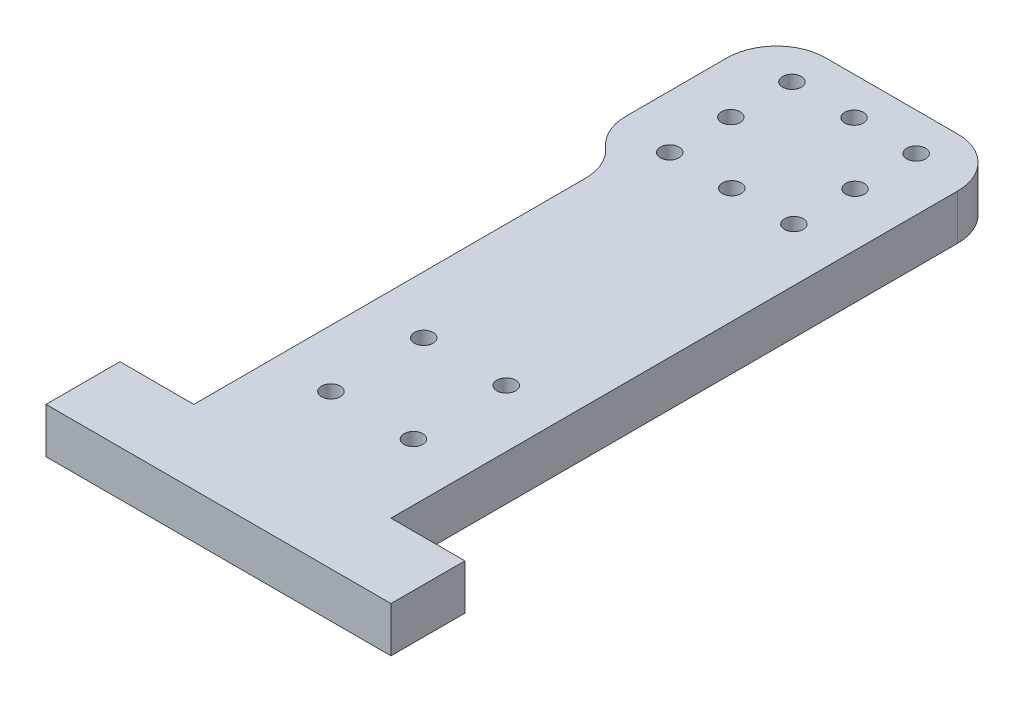
ISO-10303-21;
HEADER;
FILE_DESCRIPTION(('STEP AP214'),'2;1');
FILE_NAME('part.step','',(''),(''),'','','');
FILE_SCHEMA(('AUTOMOTIVE_DESIGN { 1 0 10303 214 1 1 1 1 }'));
ENDSEC;
DATA;
#1=APPLICATION_CONTEXT('core data for automotive mechanical design processes');
#2=APPLICATION_PROTOCOL_DEFINITION('international standard','automotive_design',2000,#1);
#3=PRODUCT_CONTEXT('',#1,'mechanical');
#4=PRODUCT('Part','Part','',(#3));
#5=PRODUCT_RELATED_PRODUCT_CATEGORY('part','',(#4));
#6=PRODUCT_DEFINITION_FORMATION('','',#4);
#7=PRODUCT_DEFINITION_CONTEXT('part definition',#1,'design');
#8=PRODUCT_DEFINITION('design','',#6,#7);
#9=PRODUCT_DEFINITION_SHAPE('','',#8);
#10=(LENGTH_UNIT() NAMED_UNIT(*) SI_UNIT(.MILLI.,.METRE.));
#11=(NAMED_UNIT(*) PLANE_ANGLE_UNIT() SI_UNIT($,.RADIAN.));
#12=(NAMED_UNIT(*) SI_UNIT($,.STERADIAN.) SOLID_ANGLE_UNIT());
#13=UNCERTAINTY_MEASURE_WITH_UNIT(LENGTH_MEASURE(1.E-05),#10,'distance_accuracy_value','');
#14=(GEOMETRIC_REPRESENTATION_CONTEXT(3) GLOBAL_UNCERTAINTY_ASSIGNED_CONTEXT((#13)) GLOBAL_UNIT_ASSIGNED_CONTEXT((#10,
#11,#12)) REPRESENTATION_CONTEXT('',''));
#15=CARTESIAN_POINT('',(0.,0.,0.));
#16=DIRECTION('',(0.,0.,1.));
#17=DIRECTION('',(1.,0.,0.));
#18=AXIS2_PLACEMENT_3D('',#15,#16,#17);
#19=CARTESIAN_POINT('',(0.,0.,0.));
#20=DIRECTION('',(0.,1.,0.));
#21=DIRECTION('',(0.,0.,1.));
#22=AXIS2_PLACEMENT_3D('',#19,#20,#21);
#23=PLANE('',#22);
#24=CARTESIAN_POINT('',(-2.15800000000001,0.,-42.5196));
#25=DIRECTION('',(0.,1.,0.));
#26=DIRECTION('',(0.,0.,1.));
#27=AXIS2_PLACEMENT_3D('',#24,#25,#26);
#28=CIRCLE('',#27,1.2065);
#29=CARTESIAN_POINT('',(-2.15800000000001,0.,-41.3131));
#30=VERTEX_POINT('',#29);
#31=EDGE_CURVE('E215',#30,#30,#28,.T.);
#32=ORIENTED_EDGE('',*,*,#31,.T.);
#33=EDGE_LOOP('',(#32));
#34=FACE_BOUND('',#33,.T.);
#35=CARTESIAN_POINT('',(-2.15800000000001,0.,-58.2676));
#36=DIRECTION('',(0.,1.,0.));
#37=DIRECTION('',(0.,0.,1.));
#38=AXIS2_PLACEMENT_3D('',#35,#36,#37);
#39=CIRCLE('',#38,1.2065);
#40=CARTESIAN_POINT('',(-2.15800000000001,0.,-57.0611));
#41=VERTEX_POINT('',#40);
#42=EDGE_CURVE('E218',#41,#41,#39,.T.);
#43=ORIENTED_EDGE('',*,*,#42,.T.);
#44=EDGE_LOOP('',(#43));
#45=FACE_BOUND('',#44,.T.);
#46=CARTESIAN_POINT('',(-10.158,0.,-58.2676));
#47=DIRECTION('',(0.,1.,0.));
#48=DIRECTION('',(0.,0.,1.));
#49=AXIS2_PLACEMENT_3D('',#46,#47,#48);
#50=CIRCLE('',#49,1.2065);
#51=CARTESIAN_POINT('',(-10.158,0.,-57.0611));
#52=VERTEX_POINT('',#51);
#53=EDGE_CURVE('E221',#52,#52,#50,.T.);
#54=ORIENTED_EDGE('',*,*,#53,.T.);
#55=EDGE_LOOP('',(#54));
#56=FACE_BOUND('',#55,.T.);
#57=CARTESIAN_POINT('',(-10.158,0.,-50.3936));
#58=DIRECTION('',(0.,1.,0.));
#59=DIRECTION('',(0.,0.,1.));
#60=AXIS2_PLACEMENT_3D('',#57,#58,#59);
#61=CIRCLE('',#60,1.2065);
#62=CARTESIAN_POINT('',(-10.158,0.,-49.1871));
#63=VERTEX_POINT('',#62);
#64=EDGE_CURVE('E224',#63,#63,#61,.T.);
#65=ORIENTED_EDGE('',*,*,#64,.T.);
#66=EDGE_LOOP('',(#65));
#67=FACE_BOUND('',#66,.T.);
#68=CARTESIAN_POINT('',(-10.158,0.,-42.5196));
#69=DIRECTION('',(0.,1.,0.));
#70=DIRECTION('',(0.,0.,1.));
#71=AXIS2_PLACEMENT_3D('',#68,#69,#70);
#72=CIRCLE('',#71,1.2065);
#73=CARTESIAN_POINT('',(-10.158,0.,-41.3131));
#74=VERTEX_POINT('',#73);
#75=EDGE_CURVE('E227',#74,#74,#72,.T.);
#76=ORIENTED_EDGE('',*,*,#75,.T.);
#77=EDGE_LOOP('',(#76));
#78=FACE_BOUND('',#77,.T.);
#79=CARTESIAN_POINT('',(5.842,0.,-58.2676));
#80=DIRECTION('',(0.,1.,0.));
#81=DIRECTION('',(0.,0.,1.));
#82=AXIS2_PLACEMENT_3D('',#79,#80,#81);
#83=CIRCLE('',#82,1.2065);
#84=CARTESIAN_POINT('',(5.842,0.,-57.0611));
#85=VERTEX_POINT('',#84);
#86=EDGE_CURVE('E230',#85,#85,#83,.T.);
#87=ORIENTED_EDGE('',*,*,#86,.T.);
#88=EDGE_LOOP('',(#87));
#89=FACE_BOUND('',#88,.T.);
#90=CARTESIAN_POINT('',(5.842,0.,-50.3936));
#91=DIRECTION('',(0.,1.,0.));
#92=DIRECTION('',(0.,0.,1.));
#93=AXIS2_PLACEMENT_3D('',#90,#91,#92);
#94=CIRCLE('',#93,1.2065);
#95=CARTESIAN_POINT('',(5.842,0.,-49.1871));
#96=VERTEX_POINT('',#95);
#97=EDGE_CURVE('E233',#96,#96,#94,.T.);
#98=ORIENTED_EDGE('',*,*,#97,.T.);
#99=EDGE_LOOP('',(#98));
#100=FACE_BOUND('',#99,.T.);
#101=CARTESIAN_POINT('',(5.842,0.,-42.5196));
#102=DIRECTION('',(0.,1.,0.));
#103=DIRECTION('',(0.,0.,1.));
#104=AXIS2_PLACEMENT_3D('',#101,#102,#103);
#105=CIRCLE('',#104,1.2065);
#106=CARTESIAN_POINT('',(5.842,0.,-41.3131));
#107=VERTEX_POINT('',#106);
#108=EDGE_CURVE('E236',#107,#107,#105,.T.);
#109=ORIENTED_EDGE('',*,*,#108,.T.);
#110=EDGE_LOOP('',(#109));
#111=FACE_BOUND('',#110,.T.);
#112=CARTESIAN_POINT('',(5.31451033065303,0.,5.97926918764177));
#113=DIRECTION('',(0.,1.,0.));
#114=DIRECTION('',(0.,0.,1.));
#115=AXIS2_PLACEMENT_3D('',#112,#113,#114);
#116=CIRCLE('',#115,1.2065);
#117=CARTESIAN_POINT('',(5.31451033065303,0.,7.18576918764177));
#118=VERTEX_POINT('',#117);
#119=EDGE_CURVE('E239',#118,#118,#116,.T.);
#120=ORIENTED_EDGE('',*,*,#119,.T.);
#121=EDGE_LOOP('',(#120));
#122=FACE_BOUND('',#121,.T.);
#123=CARTESIAN_POINT('',(-5.31451033065303,0.,5.97926918764177));
#124=DIRECTION('',(0.,1.,0.));
#125=DIRECTION('',(0.,0.,1.));
#126=AXIS2_PLACEMENT_3D('',#123,#124,#125);
#127=CIRCLE('',#126,1.2065);
#128=CARTESIAN_POINT('',(-5.31451033065303,0.,7.18576918764177));
#129=VERTEX_POINT('',#128);
#130=EDGE_CURVE('E242',#129,#129,#127,.T.);
#131=ORIENTED_EDGE('',*,*,#130,.T.);
#132=EDGE_LOOP('',(#131));
#133=FACE_BOUND('',#132,.T.);
#134=CARTESIAN_POINT('',(-5.31451033065303,0.,-5.97926918764177));
#135=DIRECTION('',(0.,1.,0.));
#136=DIRECTION('',(0.,0.,1.));
#137=AXIS2_PLACEMENT_3D('',#134,#135,#136);
#138=CIRCLE('',#137,1.2065);
#139=CARTESIAN_POINT('',(-5.31451033065303,0.,-4.77276918764177));
#140=VERTEX_POINT('',#139);
#141=EDGE_CURVE('E245',#140,#140,#138,.T.);
#142=ORIENTED_EDGE('',*,*,#141,.T.);
#143=EDGE_LOOP('',(#142));
#144=FACE_BOUND('',#143,.T.);
#145=CARTESIAN_POINT('',(5.31451033065303,0.,-5.97926918764177));
#146=DIRECTION('',(0.,1.,0.));
#147=DIRECTION('',(0.,0.,1.));
#148=AXIS2_PLACEMENT_3D('',#145,#146,#147);
#149=CIRCLE('',#148,1.2065);
#150=CARTESIAN_POINT('',(5.31451033065303,0.,-4.77276918764177));
#151=VERTEX_POINT('',#150);
#152=EDGE_CURVE('E248',#151,#151,#149,.T.);
#153=ORIENTED_EDGE('',*,*,#152,.T.);
#154=EDGE_LOOP('',(#153));
#155=FACE_BOUND('',#154,.T.);
#156=CARTESIAN_POINT('',(-10.666,0.,-43.7344255044843));
#157=DIRECTION('',(0.,-1.,0.));
#158=DIRECTION('',(0.,0.,-1.));
#159=AXIS2_PLACEMENT_3D('',#156,#157,#158);
#160=CIRCLE('',#159,6.35);
#161=CARTESIAN_POINT('',(-17.016,0.,-43.7344255044843));
#162=VERTEX_POINT('',#161);
#163=CARTESIAN_POINT('',(-14.858,0.,-38.9647676551202));
#164=VERTEX_POINT('',#163);
#165=EDGE_CURVE('E254',#162,#164,#160,.F.);
#166=ORIENTED_EDGE('',*,*,#165,.F.);
#167=DIRECTION('',(0.,0.,1.));
#168=VECTOR('',#167,1.);
#169=CARTESIAN_POINT('',(-17.016,0.,-63.119));
#170=LINE('',#169,#168);
#171=CARTESIAN_POINT('',(-17.016,0.,-56.769));
#172=VERTEX_POINT('',#171);
#173=EDGE_CURVE('E163',#172,#162,#170,.T.);
#174=ORIENTED_EDGE('',*,*,#173,.F.);
#175=CARTESIAN_POINT('',(-10.666,0.,-56.769));
#176=DIRECTION('',(0.,-1.,0.));
#177=DIRECTION('',(0.,0.,-1.));
#178=AXIS2_PLACEMENT_3D('',#175,#176,#177);
#179=CIRCLE('',#178,6.35);
#180=CARTESIAN_POINT('',(-10.666,0.,-63.119));
#181=VERTEX_POINT('',#180);
#182=EDGE_CURVE('E256',#181,#172,#179,.F.);
#183=ORIENTED_EDGE('',*,*,#182,.F.);
#184=DIRECTION('',(-1.,0.,0.));
#185=VECTOR('',#184,1.);
#186=CARTESIAN_POINT('',(12.7,0.,-63.119));
#187=LINE('',#186,#185);
#188=CARTESIAN_POINT('',(6.35,0.,-63.119));
#189=VERTEX_POINT('',#188);
#190=EDGE_CURVE('E115',#189,#181,#187,.T.);
#191=ORIENTED_EDGE('',*,*,#190,.F.);
#192=CARTESIAN_POINT('',(6.35,0.,-56.769));
#193=DIRECTION('',(0.,-1.,0.));
#194=DIRECTION('',(0.,0.,-1.));
#195=AXIS2_PLACEMENT_3D('',#192,#193,#194);
#196=CIRCLE('',#195,6.35);
#197=CARTESIAN_POINT('',(12.7,0.,-56.769));
#198=VERTEX_POINT('',#197);
#199=EDGE_CURVE('E19',#198,#189,#196,.F.);
#200=ORIENTED_EDGE('',*,*,#199,.F.);
#201=DIRECTION('',(0.,0.,-1.));
#202=VECTOR('',#201,1.);
#203=CARTESIAN_POINT('',(12.7,0.,16.256));
#204=LINE('',#203,#202);
#205=CARTESIAN_POINT('',(12.7,0.,16.256));
#206=VERTEX_POINT('',#205);
#207=EDGE_CURVE('E113',#206,#198,#204,.T.);
#208=ORIENTED_EDGE('',*,*,#207,.F.);
#209=DIRECTION('',(-1.,0.,0.));
#210=VECTOR('',#209,1.);
#211=CARTESIAN_POINT('',(22.225,0.,16.256));
#212=LINE('',#211,#210);
#213=CARTESIAN_POINT('',(22.225,0.,16.256));
#214=VERTEX_POINT('',#213);
#215=EDGE_CURVE('E128',#214,#206,#212,.T.);
#216=ORIENTED_EDGE('',*,*,#215,.F.);
#217=DIRECTION('',(0.,0.,-1.));
#218=VECTOR('',#217,1.);
#219=CARTESIAN_POINT('',(22.225,0.,25.781));
#220=LINE('',#219,#218);
#221=CARTESIAN_POINT('',(22.225,0.,25.781));
#222=VERTEX_POINT('',#221);
#223=EDGE_CURVE('E137',#222,#214,#220,.T.);
#224=ORIENTED_EDGE('',*,*,#223,.F.);
#225=DIRECTION('',(1.,0.,0.));
#226=VECTOR('',#225,1.);
#227=CARTESIAN_POINT('',(-22.225,0.,25.781));
#228=LINE('',#227,#226);
#229=CARTESIAN_POINT('',(-22.225,0.,25.781));
#230=VERTEX_POINT('',#229);
#231=EDGE_CURVE('E142',#230,#222,#228,.T.);
#232=ORIENTED_EDGE('',*,*,#231,.F.);
#233=DIRECTION('',(0.,0.,1.));
#234=VECTOR('',#233,1.);
#235=CARTESIAN_POINT('',(-22.225,0.,16.256));
#236=LINE('',#235,#234);
#237=CARTESIAN_POINT('',(-22.225,0.,16.256));
#238=VERTEX_POINT('',#237);
#239=EDGE_CURVE('E147',#238,#230,#236,.T.);
#240=ORIENTED_EDGE('',*,*,#239,.F.);
#241=DIRECTION('',(-1.,0.,0.));
#242=VECTOR('',#241,1.);
#243=CARTESIAN_POINT('',(22.225,0.,16.256));
#244=LINE('',#243,#242);
#245=CARTESIAN_POINT('',(-12.7,0.,16.256));
#246=VERTEX_POINT('',#245);
#247=EDGE_CURVE('E152',#246,#238,#244,.T.);
#248=ORIENTED_EDGE('',*,*,#247,.F.);
#249=DIRECTION('',(0.,0.,1.));
#250=VECTOR('',#249,1.);
#251=CARTESIAN_POINT('',(-12.7,0.,-16.256));
#252=LINE('',#251,#250);
#253=CARTESIAN_POINT('',(-12.7,0.,-34.1951098057562));
#254=VERTEX_POINT('',#253);
#255=EDGE_CURVE('E155',#254,#246,#252,.T.);
#256=ORIENTED_EDGE('',*,*,#255,.F.);
#257=CARTESIAN_POINT('',(-19.05,0.,-34.1951098057562));
#258=DIRECTION('',(0.,1.,0.));
#259=DIRECTION('',(0.,0.,1.));
#260=AXIS2_PLACEMENT_3D('',#257,#258,#259);
#261=CIRCLE('',#260,6.35);
#262=EDGE_CURVE('E251',#254,#164,#261,.T.);
#263=ORIENTED_EDGE('',*,*,#262,.T.);
#264=EDGE_LOOP('',(#166,#174,#183,#191,#200,#208,#216,#224,#232,#240,#248,#256,#263));
#265=FACE_BOUND('',#264,.T.);
#266=ADVANCED_FACE('F16',(#34,#45,#56,#67,#78,#89,#100,#111,#122,#133,#144,#155,#265),#23,.F.);
#267=CARTESIAN_POINT('',(6.35,14.0684504,-56.769));
#268=DIRECTION('',(0.,-1.,0.));
#269=DIRECTION('',(0.,0.,-1.));
#270=AXIS2_PLACEMENT_3D('',#267,#268,#269);
#271=CYLINDRICAL_SURFACE('',#270,6.35);
#272=DIRECTION('',(0.,1.,0.));
#273=VECTOR('',#272,1.);
#274=CARTESIAN_POINT('',(12.7,0.,-56.769));
#275=LINE('',#274,#273);
#276=CARTESIAN_POINT('',(12.7,5.842,-56.769));
#277=VERTEX_POINT('',#276);
#278=EDGE_CURVE('E120',#198,#277,#275,.T.);
#279=ORIENTED_EDGE('',*,*,#278,.F.);
#280=ORIENTED_EDGE('',*,*,#199,.T.);
#281=DIRECTION('',(0.,1.,0.));
#282=VECTOR('',#281,1.);
#283=CARTESIAN_POINT('',(6.35,5.842,-63.119));
#284=LINE('',#283,#282);
#285=CARTESIAN_POINT('',(6.35,5.842,-63.119));
#286=VERTEX_POINT('',#285);
#287=EDGE_CURVE('E118',#286,#189,#284,.F.);
#288=ORIENTED_EDGE('',*,*,#287,.F.);
#289=CARTESIAN_POINT('',(6.35,5.842,-56.769));
#290=DIRECTION('',(0.,-1.,0.));
#291=DIRECTION('',(0.,0.,-1.));
#292=AXIS2_PLACEMENT_3D('',#289,#290,#291);
#293=CIRCLE('',#292,6.35);
#294=EDGE_CURVE('E123',#277,#286,#293,.F.);
#295=ORIENTED_EDGE('',*,*,#294,.F.);
#296=EDGE_LOOP('',(#279,#280,#288,#295));
#297=FACE_BOUND('',#296,.T.);
#298=ADVANCED_FACE('F121',(#297),#271,.T.);
#299=CARTESIAN_POINT('',(12.7,5.842,-63.119));
#300=DIRECTION('',(0.,0.,-1.));
#301=DIRECTION('',(-1.,0.,0.));
#302=AXIS2_PLACEMENT_3D('',#299,#300,#301);
#303=PLANE('',#302);
#304=ORIENTED_EDGE('',*,*,#190,.T.);
#305=DIRECTION('',(0.,-1.,0.));
#306=VECTOR('',#305,1.);
#307=CARTESIAN_POINT('',(-10.666,14.0684504,-63.119));
#308=LINE('',#307,#306);
#309=CARTESIAN_POINT('',(-10.666,5.842,-63.119));
#310=VERTEX_POINT('',#309);
#311=EDGE_CURVE('E167',#310,#181,#308,.T.);
#312=ORIENTED_EDGE('',*,*,#311,.F.);
#313=DIRECTION('',(1.,0.,0.));
#314=VECTOR('',#313,1.);
#315=CARTESIAN_POINT('',(0.,5.842,-63.119));
#316=LINE('',#315,#314);
#317=EDGE_CURVE('E213',#286,#310,#316,.F.);
#318=ORIENTED_EDGE('',*,*,#317,.F.);
#319=ORIENTED_EDGE('',*,*,#287,.T.);
#320=EDGE_LOOP('',(#304,#312,#318,#319));
#321=FACE_BOUND('',#320,.T.);
#322=ADVANCED_FACE('F268',(#321),#303,.T.);
#323=CARTESIAN_POINT('',(-10.666,14.0684504,-56.769));
#324=DIRECTION('',(0.,-1.,0.));
#325=DIRECTION('',(0.,0.,-1.));
#326=AXIS2_PLACEMENT_3D('',#323,#324,#325);
#327=CYLINDRICAL_SURFACE('',#326,6.35);
#328=ORIENTED_EDGE('',*,*,#311,.T.);
#329=ORIENTED_EDGE('',*,*,#182,.T.);
#330=DIRECTION('',(0.,1.,0.));
#331=VECTOR('',#330,1.);
#332=CARTESIAN_POINT('',(-17.016,5.842,-56.769));
#333=LINE('',#332,#331);
#334=CARTESIAN_POINT('',(-17.016,5.842,-56.769));
#335=VERTEX_POINT('',#334);
#336=EDGE_CURVE('E166',#335,#172,#333,.F.);
#337=ORIENTED_EDGE('',*,*,#336,.F.);
#338=CARTESIAN_POINT('',(-10.666,5.842,-56.769));
#339=DIRECTION('',(0.,-1.,0.));
#340=DIRECTION('',(0.,0.,-1.));
#341=AXIS2_PLACEMENT_3D('',#338,#339,#340);
#342=CIRCLE('',#341,6.35);
#343=EDGE_CURVE('E210',#310,#335,#342,.F.);
#344=ORIENTED_EDGE('',*,*,#343,.F.);
#345=EDGE_LOOP('',(#328,#329,#337,#344));
#346=FACE_BOUND('',#345,.T.);
#347=ADVANCED_FACE('F346',(#346),#327,.T.);
#348=CARTESIAN_POINT('',(-17.016,5.842,-63.119));
#349=DIRECTION('',(-1.,0.,0.));
#350=DIRECTION('',(0.,0.,1.));
#351=AXIS2_PLACEMENT_3D('',#348,#349,#350);
#352=PLANE('',#351);
#353=ORIENTED_EDGE('',*,*,#173,.T.);
#354=DIRECTION('',(0.,-1.,0.));
#355=VECTOR('',#354,1.);
#356=CARTESIAN_POINT('',(-17.016,14.1910320385967,-43.7344255044843));
#357=LINE('',#356,#355);
#358=CARTESIAN_POINT('',(-17.016,5.842,-43.7344255044843));
#359=VERTEX_POINT('',#358);
#360=EDGE_CURVE('E165',#359,#162,#357,.T.);
#361=ORIENTED_EDGE('',*,*,#360,.F.);
#362=DIRECTION('',(0.,0.,1.));
#363=VECTOR('',#362,1.);
#364=CARTESIAN_POINT('',(-17.016,5.842,0.));
#365=LINE('',#364,#363);
#366=EDGE_CURVE('E209',#335,#359,#365,.T.);
#367=ORIENTED_EDGE('',*,*,#366,.F.);
#368=ORIENTED_EDGE('',*,*,#336,.T.);
#369=EDGE_LOOP('',(#353,#361,#367,#368));
#370=FACE_BOUND('',#369,.T.);
#371=ADVANCED_FACE('F340',(#370),#352,.T.);
#372=CARTESIAN_POINT('',(-10.666,14.1910320385967,-43.7344255044843));
#373=DIRECTION('',(0.,-1.,0.));
#374=DIRECTION('',(0.,0.,-1.));
#375=AXIS2_PLACEMENT_3D('',#372,#373,#374);
#376=CYLINDRICAL_SURFACE('',#375,6.35);
#377=ORIENTED_EDGE('',*,*,#165,.T.);
#378=DIRECTION('',(0.,1.,0.));
#379=VECTOR('',#378,1.);
#380=CARTESIAN_POINT('',(-14.858,-8.2264504,-38.9647676551202));
#381=LINE('',#380,#379);
#382=CARTESIAN_POINT('',(-14.858,5.842,-38.9647676551202));
#383=VERTEX_POINT('',#382);
#384=EDGE_CURVE('E253',#164,#383,#381,.T.);
#385=ORIENTED_EDGE('',*,*,#384,.T.);
#386=CARTESIAN_POINT('',(-10.666,5.842,-43.7344255044843));
#387=DIRECTION('',(0.,-1.,0.));
#388=DIRECTION('',(0.,0.,-1.));
#389=AXIS2_PLACEMENT_3D('',#386,#387,#388);
#390=CIRCLE('',#389,6.35);
#391=EDGE_CURVE('E206',#359,#383,#390,.F.);
#392=ORIENTED_EDGE('',*,*,#391,.F.);
#393=ORIENTED_EDGE('',*,*,#360,.T.);
#394=EDGE_LOOP('',(#377,#385,#392,#393));
#395=FACE_BOUND('',#394,.T.);
#396=ADVANCED_FACE('F336',(#395),#376,.T.);
#397=CARTESIAN_POINT('',(-19.05,-8.2264504,-34.1951098057562));
#398=DIRECTION('',(0.,1.,0.));
#399=DIRECTION('',(0.,0.,1.));
#400=AXIS2_PLACEMENT_3D('',#397,#398,#399);
#401=CYLINDRICAL_SURFACE('',#400,6.35);
#402=ORIENTED_EDGE('',*,*,#384,.F.);
#403=ORIENTED_EDGE('',*,*,#262,.F.);
#404=DIRECTION('',(0.,1.,0.));
#405=VECTOR('',#404,1.);
#406=CARTESIAN_POINT('',(-12.7,0.,-34.1951098057562));
#407=LINE('',#406,#405);
#408=CARTESIAN_POINT('',(-12.7,5.842,-34.1951098057562));
#409=VERTEX_POINT('',#408);
#410=EDGE_CURVE('E160',#409,#254,#407,.F.);
#411=ORIENTED_EDGE('',*,*,#410,.F.);
#412=CARTESIAN_POINT('',(-19.05,5.842,-34.1951098057562));
#413=DIRECTION('',(0.,1.,0.));
#414=DIRECTION('',(0.,0.,1.));
#415=AXIS2_PLACEMENT_3D('',#412,#413,#414);
#416=CIRCLE('',#415,6.35);
#417=EDGE_CURVE('E202',#383,#409,#416,.F.);
#418=ORIENTED_EDGE('',*,*,#417,.F.);
#419=EDGE_LOOP('',(#402,#403,#411,#418));
#420=FACE_BOUND('',#419,.T.);
#421=ADVANCED_FACE('F343',(#420),#401,.F.);
#422=CARTESIAN_POINT('',(-12.7,0.,-16.256));
#423=DIRECTION('',(-1.,0.,0.));
#424=DIRECTION('',(0.,0.,1.));
#425=AXIS2_PLACEMENT_3D('',#422,#423,#424);
#426=PLANE('',#425);
#427=ORIENTED_EDGE('',*,*,#255,.T.);
#428=DIRECTION('',(0.,1.,0.));
#429=VECTOR('',#428,1.);
#430=CARTESIAN_POINT('',(-12.7,5.842,16.256));
#431=LINE('',#430,#429);
#432=CARTESIAN_POINT('',(-12.7,5.842,16.256));
#433=VERTEX_POINT('',#432);
#434=EDGE_CURVE('E154',#433,#246,#431,.F.);
#435=ORIENTED_EDGE('',*,*,#434,.F.);
#436=DIRECTION('',(0.,0.,1.));
#437=VECTOR('',#436,1.);
#438=CARTESIAN_POINT('',(-12.7,5.842,0.));
#439=LINE('',#438,#437);
#440=EDGE_CURVE('E205',#409,#433,#439,.T.);
#441=ORIENTED_EDGE('',*,*,#440,.F.);
#442=ORIENTED_EDGE('',*,*,#410,.T.);
#443=EDGE_LOOP('',(#427,#435,#441,#442));
#444=FACE_BOUND('',#443,.T.);
#445=ADVANCED_FACE('F431',(#444),#426,.T.);
#446=CARTESIAN_POINT('',(22.225,5.842,16.256));
#447=DIRECTION('',(0.,0.,-1.));
#448=DIRECTION('',(-1.,0.,0.));
#449=AXIS2_PLACEMENT_3D('',#446,#447,#448);
#450=PLANE('',#449);
#451=DIRECTION('',(1.,0.,0.));
#452=VECTOR('',#451,1.);
#453=CARTESIAN_POINT('',(0.,5.842,16.256));
#454=LINE('',#453,#452);
#455=CARTESIAN_POINT('',(-22.225,5.842,16.256));
#456=VERTEX_POINT('',#455);
#457=EDGE_CURVE('E284',#433,#456,#454,.F.);
#458=ORIENTED_EDGE('',*,*,#457,.F.);
#459=ORIENTED_EDGE('',*,*,#434,.T.);
#460=ORIENTED_EDGE('',*,*,#247,.T.);
#461=DIRECTION('',(0.,1.,0.));
#462=VECTOR('',#461,1.);
#463=CARTESIAN_POINT('',(-22.225,5.842,16.256));
#464=LINE('',#463,#462);
#465=EDGE_CURVE('E149',#456,#238,#464,.F.);
#466=ORIENTED_EDGE('',*,*,#465,.F.);
#467=EDGE_LOOP('',(#458,#459,#460,#466));
#468=FACE_BOUND('',#467,.T.);
#469=ADVANCED_FACE('F427',(#468),#450,.T.);
#470=CARTESIAN_POINT('',(-22.225,5.842,16.256));
#471=DIRECTION('',(-1.,0.,0.));
#472=DIRECTION('',(0.,0.,1.));
#473=AXIS2_PLACEMENT_3D('',#470,#471,#472);
#474=PLANE('',#473);
#475=DIRECTION('',(0.,1.,0.));
#476=VECTOR('',#475,1.);
#477=CARTESIAN_POINT('',(-22.225,5.842,25.781));
#478=LINE('',#477,#476);
#479=CARTESIAN_POINT('',(-22.225,5.842,25.781));
#480=VERTEX_POINT('',#479);
#481=EDGE_CURVE('E144',#480,#230,#478,.F.);
#482=ORIENTED_EDGE('',*,*,#481,.F.);
#483=DIRECTION('',(0.,0.,1.));
#484=VECTOR('',#483,1.);
#485=CARTESIAN_POINT('',(-22.225,5.842,0.));
#486=LINE('',#485,#484);
#487=EDGE_CURVE('E308',#456,#480,#486,.T.);
#488=ORIENTED_EDGE('',*,*,#487,.F.);
#489=ORIENTED_EDGE('',*,*,#465,.T.);
#490=ORIENTED_EDGE('',*,*,#239,.T.);
#491=EDGE_LOOP('',(#482,#488,#489,#490));
#492=FACE_BOUND('',#491,.T.);
#493=ADVANCED_FACE('F423',(#492),#474,.T.);
#494=CARTESIAN_POINT('',(-22.225,5.842,25.781));
#495=DIRECTION('',(0.,0.,1.));
#496=DIRECTION('',(1.,0.,0.));
#497=AXIS2_PLACEMENT_3D('',#494,#495,#496);
#498=PLANE('',#497);
#499=DIRECTION('',(0.,1.,0.));
#500=VECTOR('',#499,1.);
#501=CARTESIAN_POINT('',(22.225,5.842,25.781));
#502=LINE('',#501,#500);
#503=CARTESIAN_POINT('',(22.225,5.842,25.781));
#504=VERTEX_POINT('',#503);
#505=EDGE_CURVE('E139',#504,#222,#502,.F.);
#506=ORIENTED_EDGE('',*,*,#505,.F.);
#507=DIRECTION('',(1.,0.,0.));
#508=VECTOR('',#507,1.);
#509=CARTESIAN_POINT('',(0.,5.842,25.781));
#510=LINE('',#509,#508);
#511=EDGE_CURVE('E299',#480,#504,#510,.T.);
#512=ORIENTED_EDGE('',*,*,#511,.F.);
#513=ORIENTED_EDGE('',*,*,#481,.T.);
#514=ORIENTED_EDGE('',*,*,#231,.T.);
#515=EDGE_LOOP('',(#506,#512,#513,#514));
#516=FACE_BOUND('',#515,.T.);
#517=ADVANCED_FACE('F419',(#516),#498,.T.);
#518=CARTESIAN_POINT('',(22.225,5.842,25.781));
#519=DIRECTION('',(1.,0.,0.));
#520=DIRECTION('',(0.,0.,-1.));
#521=AXIS2_PLACEMENT_3D('',#518,#519,#520);
#522=PLANE('',#521);
#523=DIRECTION('',(0.,1.,0.));
#524=VECTOR('',#523,1.);
#525=CARTESIAN_POINT('',(22.225,5.842,16.256));
#526=LINE('',#525,#524);
#527=CARTESIAN_POINT('',(22.225,5.842,16.256));
#528=VERTEX_POINT('',#527);
#529=EDGE_CURVE('E130',#528,#214,#526,.F.);
#530=ORIENTED_EDGE('',*,*,#529,.F.);
#531=DIRECTION('',(0.,0.,1.));
#532=VECTOR('',#531,1.);
#533=CARTESIAN_POINT('',(22.225,5.842,0.));
#534=LINE('',#533,#532);
#535=EDGE_CURVE('E277',#504,#528,#534,.F.);
#536=ORIENTED_EDGE('',*,*,#535,.F.);
#537=ORIENTED_EDGE('',*,*,#505,.T.);
#538=ORIENTED_EDGE('',*,*,#223,.T.);
#539=EDGE_LOOP('',(#530,#536,#537,#538));
#540=FACE_BOUND('',#539,.T.);
#541=ADVANCED_FACE('F416',(#540),#522,.T.);
#542=CARTESIAN_POINT('',(22.225,5.842,16.256));
#543=DIRECTION('',(0.,0.,-1.));
#544=DIRECTION('',(-1.,0.,0.));
#545=AXIS2_PLACEMENT_3D('',#542,#543,#544);
#546=PLANE('',#545);
#547=ORIENTED_EDGE('',*,*,#215,.T.);
#548=DIRECTION('',(0.,1.,0.));
#549=VECTOR('',#548,1.);
#550=CARTESIAN_POINT('',(12.7,0.,16.256));
#551=LINE('',#550,#549);
#552=CARTESIAN_POINT('',(12.7,5.842,16.256));
#553=VERTEX_POINT('',#552);
#554=EDGE_CURVE('E34',#553,#206,#551,.F.);
#555=ORIENTED_EDGE('',*,*,#554,.F.);
#556=DIRECTION('',(1.,0.,0.));
#557=VECTOR('',#556,1.);
#558=CARTESIAN_POINT('',(0.,5.842,16.256));
#559=LINE('',#558,#557);
#560=EDGE_CURVE('E275',#528,#553,#559,.F.);
#561=ORIENTED_EDGE('',*,*,#560,.F.);
#562=ORIENTED_EDGE('',*,*,#529,.T.);
#563=EDGE_LOOP('',(#547,#555,#561,#562));
#564=FACE_BOUND('',#563,.T.);
#565=ADVANCED_FACE('F413',(#564),#546,.T.);
#566=CARTESIAN_POINT('',(12.7,0.,16.256));
#567=DIRECTION('',(1.,0.,0.));
#568=DIRECTION('',(0.,0.,-1.));
#569=AXIS2_PLACEMENT_3D('',#566,#567,#568);
#570=PLANE('',#569);
#571=DIRECTION('',(0.,0.,1.));
#572=VECTOR('',#571,1.);
#573=CARTESIAN_POINT('',(12.7,5.842,0.));
#574=LINE('',#573,#572);
#575=EDGE_CURVE('E201',#553,#277,#574,.F.);
#576=ORIENTED_EDGE('',*,*,#575,.F.);
#577=ORIENTED_EDGE('',*,*,#554,.T.);
#578=ORIENTED_EDGE('',*,*,#207,.T.);
#579=ORIENTED_EDGE('',*,*,#278,.T.);
#580=EDGE_LOOP('',(#576,#577,#578,#579));
#581=FACE_BOUND('',#580,.T.);
#582=ADVANCED_FACE('F127',(#581),#570,.T.);
#583=CARTESIAN_POINT('',(5.31451033065303,0.,-5.97926918764177));
#584=DIRECTION('',(0.,1.,0.));
#585=DIRECTION('',(0.,0.,1.));
#586=AXIS2_PLACEMENT_3D('',#583,#584,#585);
#587=CYLINDRICAL_SURFACE('',#586,1.2065);
#588=CARTESIAN_POINT('',(5.31451033065303,5.842,-5.97926918764177));
#589=DIRECTION('',(0.,1.,0.));
#590=DIRECTION('',(0.,0.,1.));
#591=AXIS2_PLACEMENT_3D('',#588,#589,#590);
#592=CIRCLE('',#591,1.2065);
#593=CARTESIAN_POINT('',(5.31451033065303,5.842,-4.77276918764177));
#594=VERTEX_POINT('',#593);
#595=EDGE_CURVE('E198',#594,#594,#592,.F.);
#596=ORIENTED_EDGE('',*,*,#595,.F.);
#597=EDGE_LOOP('',(#596));
#598=FACE_BOUND('',#597,.T.);
#599=ORIENTED_EDGE('',*,*,#152,.F.);
#600=EDGE_LOOP('',(#599));
#601=FACE_BOUND('',#600,.T.);
#602=ADVANCED_FACE('F406',(#598,#601),#587,.F.);
#603=CARTESIAN_POINT('',(-5.31451033065303,0.,-5.97926918764177));
#604=DIRECTION('',(0.,1.,0.));
#605=DIRECTION('',(0.,0.,1.));
#606=AXIS2_PLACEMENT_3D('',#603,#604,#605);
#607=CYLINDRICAL_SURFACE('',#606,1.2065);
#608=CARTESIAN_POINT('',(-5.31451033065303,5.842,-5.97926918764177));
#609=DIRECTION('',(0.,1.,0.));
#610=DIRECTION('',(0.,0.,1.));
#611=AXIS2_PLACEMENT_3D('',#608,#609,#610);
#612=CIRCLE('',#611,1.2065);
#613=CARTESIAN_POINT('',(-5.31451033065303,5.842,-4.77276918764177));
#614=VERTEX_POINT('',#613);
#615=EDGE_CURVE('E195',#614,#614,#612,.F.);
#616=ORIENTED_EDGE('',*,*,#615,.F.);
#617=EDGE_LOOP('',(#616));
#618=FACE_BOUND('',#617,.T.);
#619=ORIENTED_EDGE('',*,*,#141,.F.);
#620=EDGE_LOOP('',(#619));
#621=FACE_BOUND('',#620,.T.);
#622=ADVANCED_FACE('F402',(#618,#621),#607,.F.);
#623=CARTESIAN_POINT('',(-5.31451033065303,0.,5.97926918764177));
#624=DIRECTION('',(0.,1.,0.));
#625=DIRECTION('',(0.,0.,1.));
#626=AXIS2_PLACEMENT_3D('',#623,#624,#625);
#627=CYLINDRICAL_SURFACE('',#626,1.2065);
#628=CARTESIAN_POINT('',(-5.31451033065303,5.842,5.97926918764177));
#629=DIRECTION('',(0.,1.,0.));
#630=DIRECTION('',(0.,0.,1.));
#631=AXIS2_PLACEMENT_3D('',#628,#629,#630);
#632=CIRCLE('',#631,1.2065);
#633=CARTESIAN_POINT('',(-5.31451033065303,5.842,7.18576918764177));
#634=VERTEX_POINT('',#633);
#635=EDGE_CURVE('E192',#634,#634,#632,.F.);
#636=ORIENTED_EDGE('',*,*,#635,.F.);
#637=EDGE_LOOP('',(#636));
#638=FACE_BOUND('',#637,.T.);
#639=ORIENTED_EDGE('',*,*,#130,.F.);
#640=EDGE_LOOP('',(#639));
#641=FACE_BOUND('',#640,.T.);
#642=ADVANCED_FACE('F398',(#638,#641),#627,.F.);
#643=CARTESIAN_POINT('',(5.31451033065303,0.,5.97926918764177));
#644=DIRECTION('',(0.,1.,0.));
#645=DIRECTION('',(0.,0.,1.));
#646=AXIS2_PLACEMENT_3D('',#643,#644,#645);
#647=CYLINDRICAL_SURFACE('',#646,1.2065);
#648=CARTESIAN_POINT('',(5.31451033065303,5.842,5.97926918764177));
#649=DIRECTION('',(0.,1.,0.));
#650=DIRECTION('',(0.,0.,1.));
#651=AXIS2_PLACEMENT_3D('',#648,#649,#650);
#652=CIRCLE('',#651,1.2065);
#653=CARTESIAN_POINT('',(5.31451033065303,5.842,7.18576918764177));
#654=VERTEX_POINT('',#653);
#655=EDGE_CURVE('E189',#654,#654,#652,.F.);
#656=ORIENTED_EDGE('',*,*,#655,.F.);
#657=EDGE_LOOP('',(#656));
#658=FACE_BOUND('',#657,.T.);
#659=ORIENTED_EDGE('',*,*,#119,.F.);
#660=EDGE_LOOP('',(#659));
#661=FACE_BOUND('',#660,.T.);
#662=ADVANCED_FACE('F394',(#658,#661),#647,.F.);
#663=CARTESIAN_POINT('',(5.842,5.842,-42.5196));
#664=DIRECTION('',(0.,1.,0.));
#665=DIRECTION('',(0.,0.,1.));
#666=AXIS2_PLACEMENT_3D('',#663,#664,#665);
#667=CYLINDRICAL_SURFACE('',#666,1.2065);
#668=CARTESIAN_POINT('',(5.842,5.842,-42.5196));
#669=DIRECTION('',(0.,1.,0.));
#670=DIRECTION('',(0.,0.,1.));
#671=AXIS2_PLACEMENT_3D('',#668,#669,#670);
#672=CIRCLE('',#671,1.2065);
#673=CARTESIAN_POINT('',(5.842,5.842,-41.3131));
#674=VERTEX_POINT('',#673);
#675=EDGE_CURVE('E186',#674,#674,#672,.F.);
#676=ORIENTED_EDGE('',*,*,#675,.F.);
#677=EDGE_LOOP('',(#676));
#678=FACE_BOUND('',#677,.T.);
#679=ORIENTED_EDGE('',*,*,#108,.F.);
#680=EDGE_LOOP('',(#679));
#681=FACE_BOUND('',#680,.T.);
#682=ADVANCED_FACE('F390',(#678,#681),#667,.F.);
#683=CARTESIAN_POINT('',(5.842,5.842,-50.3936));
#684=DIRECTION('',(0.,1.,0.));
#685=DIRECTION('',(0.,0.,1.));
#686=AXIS2_PLACEMENT_3D('',#683,#684,#685);
#687=CYLINDRICAL_SURFACE('',#686,1.2065);
#688=CARTESIAN_POINT('',(5.842,5.842,-50.3936));
#689=DIRECTION('',(0.,1.,0.));
#690=DIRECTION('',(0.,0.,1.));
#691=AXIS2_PLACEMENT_3D('',#688,#689,#690);
#692=CIRCLE('',#691,1.2065);
#693=CARTESIAN_POINT('',(5.842,5.842,-49.1871));
#694=VERTEX_POINT('',#693);
#695=EDGE_CURVE('E183',#694,#694,#692,.F.);
#696=ORIENTED_EDGE('',*,*,#695,.F.);
#697=EDGE_LOOP('',(#696));
#698=FACE_BOUND('',#697,.T.);
#699=ORIENTED_EDGE('',*,*,#97,.F.);
#700=EDGE_LOOP('',(#699));
#701=FACE_BOUND('',#700,.T.);
#702=ADVANCED_FACE('F386',(#698,#701),#687,.F.);
#703=CARTESIAN_POINT('',(5.842,5.842,-58.2676));
#704=DIRECTION('',(0.,1.,0.));
#705=DIRECTION('',(0.,0.,1.));
#706=AXIS2_PLACEMENT_3D('',#703,#704,#705);
#707=CYLINDRICAL_SURFACE('',#706,1.2065);
#708=CARTESIAN_POINT('',(5.842,5.842,-58.2676));
#709=DIRECTION('',(0.,1.,0.));
#710=DIRECTION('',(0.,0.,1.));
#711=AXIS2_PLACEMENT_3D('',#708,#709,#710);
#712=CIRCLE('',#711,1.2065);
#713=CARTESIAN_POINT('',(5.842,5.842,-57.0611));
#714=VERTEX_POINT('',#713);
#715=EDGE_CURVE('E180',#714,#714,#712,.F.);
#716=ORIENTED_EDGE('',*,*,#715,.F.);
#717=EDGE_LOOP('',(#716));
#718=FACE_BOUND('',#717,.T.);
#719=ORIENTED_EDGE('',*,*,#86,.F.);
#720=EDGE_LOOP('',(#719));
#721=FACE_BOUND('',#720,.T.);
#722=ADVANCED_FACE('F382',(#718,#721),#707,.F.);
#723=CARTESIAN_POINT('',(-10.158,5.842,-42.5196));
#724=DIRECTION('',(0.,1.,0.));
#725=DIRECTION('',(0.,0.,1.));
#726=AXIS2_PLACEMENT_3D('',#723,#724,#725);
#727=CYLINDRICAL_SURFACE('',#726,1.2065);
#728=CARTESIAN_POINT('',(-10.158,5.842,-42.5196));
#729=DIRECTION('',(0.,1.,0.));
#730=DIRECTION('',(0.,0.,1.));
#731=AXIS2_PLACEMENT_3D('',#728,#729,#730);
#732=CIRCLE('',#731,1.2065);
#733=CARTESIAN_POINT('',(-10.158,5.842,-41.3131));
#734=VERTEX_POINT('',#733);
#735=EDGE_CURVE('E177',#734,#734,#732,.F.);
#736=ORIENTED_EDGE('',*,*,#735,.F.);
#737=EDGE_LOOP('',(#736));
#738=FACE_BOUND('',#737,.T.);
#739=ORIENTED_EDGE('',*,*,#75,.F.);
#740=EDGE_LOOP('',(#739));
#741=FACE_BOUND('',#740,.T.);
#742=ADVANCED_FACE('F378',(#738,#741),#727,.F.);
#743=CARTESIAN_POINT('',(-10.158,5.842,-50.3936));
#744=DIRECTION('',(0.,1.,0.));
#745=DIRECTION('',(0.,0.,1.));
#746=AXIS2_PLACEMENT_3D('',#743,#744,#745);
#747=CYLINDRICAL_SURFACE('',#746,1.2065);
#748=CARTESIAN_POINT('',(-10.158,5.842,-50.3936));
#749=DIRECTION('',(0.,1.,0.));
#750=DIRECTION('',(0.,0.,1.));
#751=AXIS2_PLACEMENT_3D('',#748,#749,#750);
#752=CIRCLE('',#751,1.2065);
#753=CARTESIAN_POINT('',(-10.158,5.842,-49.1871));
#754=VERTEX_POINT('',#753);
#755=EDGE_CURVE('E174',#754,#754,#752,.F.);
#756=ORIENTED_EDGE('',*,*,#755,.F.);
#757=EDGE_LOOP('',(#756));
#758=FACE_BOUND('',#757,.T.);
#759=ORIENTED_EDGE('',*,*,#64,.F.);
#760=EDGE_LOOP('',(#759));
#761=FACE_BOUND('',#760,.T.);
#762=ADVANCED_FACE('F374',(#758,#761),#747,.F.);
#763=CARTESIAN_POINT('',(-10.158,5.842,-58.2676));
#764=DIRECTION('',(0.,1.,0.));
#765=DIRECTION('',(0.,0.,1.));
#766=AXIS2_PLACEMENT_3D('',#763,#764,#765);
#767=CYLINDRICAL_SURFACE('',#766,1.2065);
#768=CARTESIAN_POINT('',(-10.158,5.842,-58.2676));
#769=DIRECTION('',(0.,1.,0.));
#770=DIRECTION('',(0.,0.,1.));
#771=AXIS2_PLACEMENT_3D('',#768,#769,#770);
#772=CIRCLE('',#771,1.2065);
#773=CARTESIAN_POINT('',(-10.158,5.842,-57.0611));
#774=VERTEX_POINT('',#773);
#775=EDGE_CURVE('E171',#774,#774,#772,.F.);
#776=ORIENTED_EDGE('',*,*,#775,.F.);
#777=EDGE_LOOP('',(#776));
#778=FACE_BOUND('',#777,.T.);
#779=ORIENTED_EDGE('',*,*,#53,.F.);
#780=EDGE_LOOP('',(#779));
#781=FACE_BOUND('',#780,.T.);
#782=ADVANCED_FACE('F370',(#778,#781),#767,.F.);
#783=CARTESIAN_POINT('',(-2.15800000000001,5.842,-58.2676));
#784=DIRECTION('',(0.,1.,0.));
#785=DIRECTION('',(0.,0.,1.));
#786=AXIS2_PLACEMENT_3D('',#783,#784,#785);
#787=CYLINDRICAL_SURFACE('',#786,1.2065);
#788=CARTESIAN_POINT('',(-2.15800000000001,5.842,-58.2676));
#789=DIRECTION('',(0.,1.,0.));
#790=DIRECTION('',(0.,0.,1.));
#791=AXIS2_PLACEMENT_3D('',#788,#789,#790);
#792=CIRCLE('',#791,1.2065);
#793=CARTESIAN_POINT('',(-2.15800000000001,5.842,-57.0611));
#794=VERTEX_POINT('',#793);
#795=EDGE_CURVE('E25',#794,#794,#792,.F.);
#796=ORIENTED_EDGE('',*,*,#795,.F.);
#797=EDGE_LOOP('',(#796));
#798=FACE_BOUND('',#797,.T.);
#799=ORIENTED_EDGE('',*,*,#42,.F.);
#800=EDGE_LOOP('',(#799));
#801=FACE_BOUND('',#800,.T.);
#802=ADVANCED_FACE('F363',(#798,#801),#787,.F.);
#803=CARTESIAN_POINT('',(-2.15800000000001,5.842,-42.5196));
#804=DIRECTION('',(0.,1.,0.));
#805=DIRECTION('',(0.,0.,1.));
#806=AXIS2_PLACEMENT_3D('',#803,#804,#805);
#807=CYLINDRICAL_SURFACE('',#806,1.2065);
#808=CARTESIAN_POINT('',(-2.15800000000001,5.842,-42.5196));
#809=DIRECTION('',(0.,1.,0.));
#810=DIRECTION('',(0.,0.,1.));
#811=AXIS2_PLACEMENT_3D('',#808,#809,#810);
#812=CIRCLE('',#811,1.2065);
#813=CARTESIAN_POINT('',(-2.15800000000001,5.842,-41.3131));
#814=VERTEX_POINT('',#813);
#815=EDGE_CURVE('E11',#814,#814,#812,.F.);
#816=ORIENTED_EDGE('',*,*,#815,.F.);
#817=EDGE_LOOP('',(#816));
#818=FACE_BOUND('',#817,.T.);
#819=ORIENTED_EDGE('',*,*,#31,.F.);
#820=EDGE_LOOP('',(#819));
#821=FACE_BOUND('',#820,.T.);
#822=ADVANCED_FACE('F357',(#818,#821),#807,.F.);
#823=CARTESIAN_POINT('',(0.,5.842,0.));
#824=DIRECTION('',(0.,1.,0.));
#825=DIRECTION('',(0.,0.,1.));
#826=AXIS2_PLACEMENT_3D('',#823,#824,#825);
#827=PLANE('',#826);
#828=ORIENTED_EDGE('',*,*,#815,.T.);
#829=EDGE_LOOP('',(#828));
#830=FACE_BOUND('',#829,.T.);
#831=ORIENTED_EDGE('',*,*,#795,.T.);
#832=EDGE_LOOP('',(#831));
#833=FACE_BOUND('',#832,.T.);
#834=ORIENTED_EDGE('',*,*,#775,.T.);
#835=EDGE_LOOP('',(#834));
#836=FACE_BOUND('',#835,.T.);
#837=ORIENTED_EDGE('',*,*,#755,.T.);
#838=EDGE_LOOP('',(#837));
#839=FACE_BOUND('',#838,.T.);
#840=ORIENTED_EDGE('',*,*,#735,.T.);
#841=EDGE_LOOP('',(#840));
#842=FACE_BOUND('',#841,.T.);
#843=ORIENTED_EDGE('',*,*,#715,.T.);
#844=EDGE_LOOP('',(#843));
#845=FACE_BOUND('',#844,.T.);
#846=ORIENTED_EDGE('',*,*,#695,.T.);
#847=EDGE_LOOP('',(#846));
#848=FACE_BOUND('',#847,.T.);
#849=ORIENTED_EDGE('',*,*,#675,.T.);
#850=EDGE_LOOP('',(#849));
#851=FACE_BOUND('',#850,.T.);
#852=ORIENTED_EDGE('',*,*,#655,.T.);
#853=EDGE_LOOP('',(#852));
#854=FACE_BOUND('',#853,.T.);
#855=ORIENTED_EDGE('',*,*,#635,.T.);
#856=EDGE_LOOP('',(#855));
#857=FACE_BOUND('',#856,.T.);
#858=ORIENTED_EDGE('',*,*,#615,.T.);
#859=EDGE_LOOP('',(#858));
#860=FACE_BOUND('',#859,.T.);
#861=ORIENTED_EDGE('',*,*,#595,.T.);
#862=EDGE_LOOP('',(#861));
#863=FACE_BOUND('',#862,.T.);
#864=ORIENTED_EDGE('',*,*,#560,.T.);
#865=ORIENTED_EDGE('',*,*,#575,.T.);
#866=ORIENTED_EDGE('',*,*,#294,.T.);
#867=ORIENTED_EDGE('',*,*,#317,.T.);
#868=ORIENTED_EDGE('',*,*,#343,.T.);
#869=ORIENTED_EDGE('',*,*,#366,.T.);
#870=ORIENTED_EDGE('',*,*,#391,.T.);
#871=ORIENTED_EDGE('',*,*,#417,.T.);
#872=ORIENTED_EDGE('',*,*,#440,.T.);
#873=ORIENTED_EDGE('',*,*,#457,.T.);
#874=ORIENTED_EDGE('',*,*,#487,.T.);
#875=ORIENTED_EDGE('',*,*,#511,.T.);
#876=ORIENTED_EDGE('',*,*,#535,.T.);
#877=EDGE_LOOP('',(#864,#865,#866,#867,#868,#869,#870,#871,#872,#873,#874,#875,#876));
#878=FACE_BOUND('',#877,.T.);
#879=ADVANCED_FACE('F273',(#830,#833,#836,#839,#842,#845,#848,#851,#854,#857,#860,#863,#878),
#827,.T.);
#880=CLOSED_SHELL('',(#266,#298,#322,#347,#371,#396,#421,#445,#469,#493,#517,#541,#565,#582,
#602,#622,#642,#662,#682,#702,#722,#742,#762,#782,#802,#822,#879));
#881=MANIFOLD_SOLID_BREP('B1',#880);
#882=ADVANCED_BREP_SHAPE_REPRESENTATION('',(#18,#881),#14);
#883=SHAPE_DEFINITION_REPRESENTATION(#9,#882);
ENDSEC;
END-ISO-10303-21;
